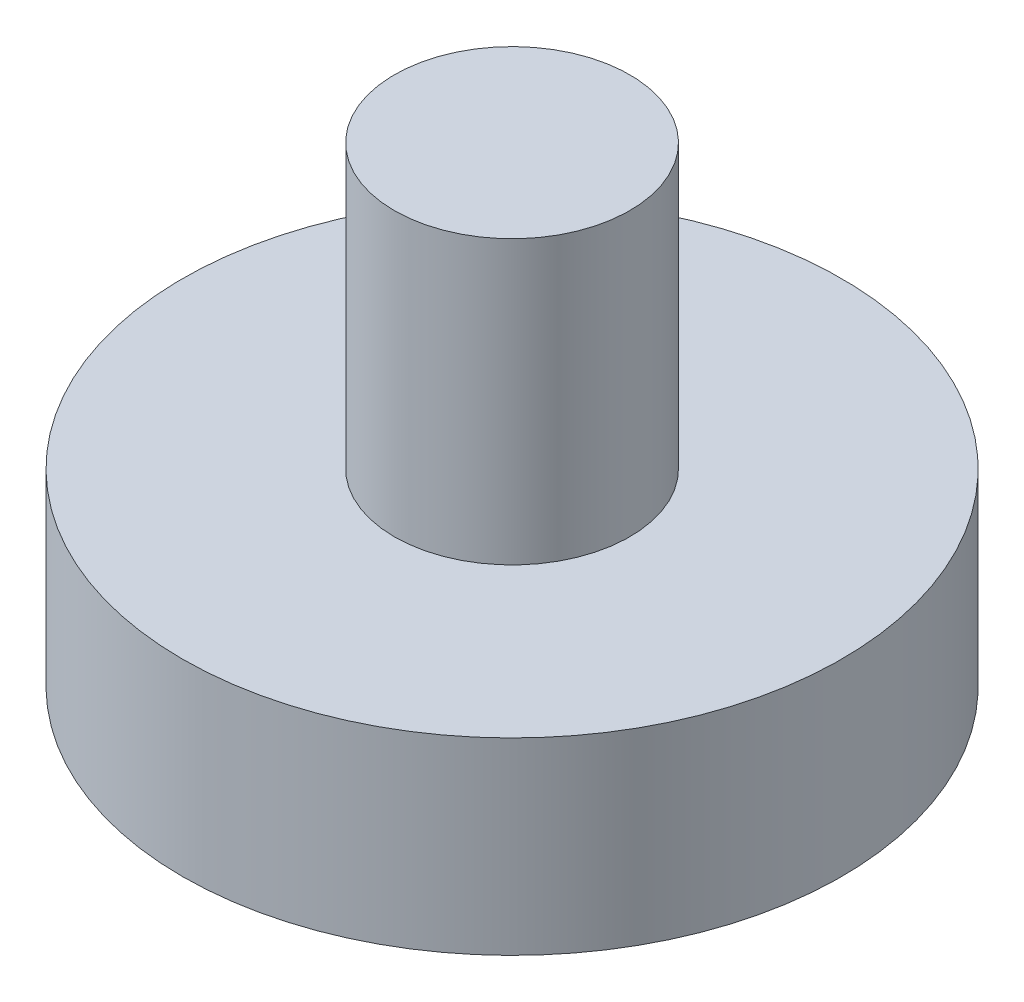
ISO-10303-21;
HEADER;
FILE_DESCRIPTION(('STEP AP214'),'2;1');
FILE_NAME('part.step','',(''),(''),'','','');
FILE_SCHEMA(('AUTOMOTIVE_DESIGN { 1 0 10303 214 1 1 1 1 }'));
ENDSEC;
DATA;
#1=APPLICATION_CONTEXT('core data for automotive mechanical design processes');
#2=APPLICATION_PROTOCOL_DEFINITION('international standard','automotive_design',2000,#1);
#3=PRODUCT_CONTEXT('',#1,'mechanical');
#4=PRODUCT('Part','Part','',(#3));
#5=PRODUCT_RELATED_PRODUCT_CATEGORY('part','',(#4));
#6=PRODUCT_DEFINITION_FORMATION('','',#4);
#7=PRODUCT_DEFINITION_CONTEXT('part definition',#1,'design');
#8=PRODUCT_DEFINITION('design','',#6,#7);
#9=PRODUCT_DEFINITION_SHAPE('','',#8);
#10=(LENGTH_UNIT() NAMED_UNIT(*) SI_UNIT(.MILLI.,.METRE.));
#11=(NAMED_UNIT(*) PLANE_ANGLE_UNIT() SI_UNIT($,.RADIAN.));
#12=(NAMED_UNIT(*) SI_UNIT($,.STERADIAN.) SOLID_ANGLE_UNIT());
#13=UNCERTAINTY_MEASURE_WITH_UNIT(LENGTH_MEASURE(1.E-05),#10,'distance_accuracy_value','');
#14=(GEOMETRIC_REPRESENTATION_CONTEXT(3) GLOBAL_UNCERTAINTY_ASSIGNED_CONTEXT((#13)) GLOBAL_UNIT_ASSIGNED_CONTEXT((#10,
#11,#12)) REPRESENTATION_CONTEXT('',''));
#15=CARTESIAN_POINT('',(0.,0.,0.));
#16=DIRECTION('',(0.,0.,1.));
#17=DIRECTION('',(1.,0.,0.));
#18=AXIS2_PLACEMENT_3D('',#15,#16,#17);
#19=CARTESIAN_POINT('',(0.,2.,0.));
#20=DIRECTION('',(0.,-1.,0.));
#21=DIRECTION('',(0.,0.,-1.));
#22=AXIS2_PLACEMENT_3D('',#19,#20,#21);
#23=CYLINDRICAL_SURFACE('',#22,3.5);
#24=CARTESIAN_POINT('',(0.,2.,0.));
#25=DIRECTION('',(0.,1.,0.));
#26=DIRECTION('',(0.,0.,1.));
#27=AXIS2_PLACEMENT_3D('',#24,#25,#26);
#28=CIRCLE('',#27,3.5);
#29=CARTESIAN_POINT('',(0.,2.,3.5));
#30=VERTEX_POINT('',#29);
#31=EDGE_CURVE('E45',#30,#30,#28,.T.);
#32=ORIENTED_EDGE('',*,*,#31,.F.);
#33=EDGE_LOOP('',(#32));
#34=FACE_BOUND('',#33,.T.);
#35=CARTESIAN_POINT('',(0.,0.,0.));
#36=DIRECTION('',(0.,1.,0.));
#37=DIRECTION('',(0.,0.,1.));
#38=AXIS2_PLACEMENT_3D('',#35,#36,#37);
#39=CIRCLE('',#38,3.5);
#40=CARTESIAN_POINT('',(0.,0.,3.5));
#41=VERTEX_POINT('',#40);
#42=EDGE_CURVE('E40',#41,#41,#39,.T.);
#43=ORIENTED_EDGE('',*,*,#42,.T.);
#44=EDGE_LOOP('',(#43));
#45=FACE_BOUND('',#44,.T.);
#46=ADVANCED_FACE('F37',(#34,#45),#23,.T.);
#47=CARTESIAN_POINT('',(0.,2.,0.));
#48=DIRECTION('',(0.,1.,0.));
#49=DIRECTION('',(0.,0.,1.));
#50=AXIS2_PLACEMENT_3D('',#47,#48,#49);
#51=PLANE('',#50);
#52=CARTESIAN_POINT('',(0.,2.,0.));
#53=DIRECTION('',(0.,1.,0.));
#54=DIRECTION('',(0.,0.,1.));
#55=AXIS2_PLACEMENT_3D('',#52,#53,#54);
#56=CIRCLE('',#55,1.25);
#57=CARTESIAN_POINT('',(0.,2.,1.25));
#58=VERTEX_POINT('',#57);
#59=EDGE_CURVE('E10',#58,#58,#56,.T.);
#60=ORIENTED_EDGE('',*,*,#59,.F.);
#61=EDGE_LOOP('',(#60));
#62=FACE_BOUND('',#61,.T.);
#63=ORIENTED_EDGE('',*,*,#31,.T.);
#64=EDGE_LOOP('',(#63));
#65=FACE_BOUND('',#64,.T.);
#66=ADVANCED_FACE('F65',(#62,#65),#51,.T.);
#67=CARTESIAN_POINT('',(0.,0.,0.));
#68=DIRECTION('',(0.,1.,0.));
#69=DIRECTION('',(0.,0.,1.));
#70=AXIS2_PLACEMENT_3D('',#67,#68,#69);
#71=PLANE('',#70);
#72=ORIENTED_EDGE('',*,*,#42,.F.);
#73=EDGE_LOOP('',(#72));
#74=FACE_BOUND('',#73,.T.);
#75=ADVANCED_FACE('F62',(#74),#71,.F.);
#76=CARTESIAN_POINT('',(0.,5.,0.));
#77=DIRECTION('',(0.,-1.,0.));
#78=DIRECTION('',(0.,0.,-1.));
#79=AXIS2_PLACEMENT_3D('',#76,#77,#78);
#80=CYLINDRICAL_SURFACE('',#79,1.25);
#81=CARTESIAN_POINT('',(0.,5.,0.));
#82=DIRECTION('',(0.,1.,0.));
#83=DIRECTION('',(0.,0.,1.));
#84=AXIS2_PLACEMENT_3D('',#81,#82,#83);
#85=CIRCLE('',#84,1.25);
#86=CARTESIAN_POINT('',(0.,5.,1.25));
#87=VERTEX_POINT('',#86);
#88=EDGE_CURVE('E52',#87,#87,#85,.T.);
#89=ORIENTED_EDGE('',*,*,#88,.F.);
#90=EDGE_LOOP('',(#89));
#91=FACE_BOUND('',#90,.T.);
#92=ORIENTED_EDGE('',*,*,#59,.T.);
#93=EDGE_LOOP('',(#92));
#94=FACE_BOUND('',#93,.T.);
#95=ADVANCED_FACE('F64',(#91,#94),#80,.T.);
#96=CARTESIAN_POINT('',(0.,5.,0.));
#97=DIRECTION('',(0.,1.,0.));
#98=DIRECTION('',(0.,0.,1.));
#99=AXIS2_PLACEMENT_3D('',#96,#97,#98);
#100=PLANE('',#99);
#101=ORIENTED_EDGE('',*,*,#88,.T.);
#102=EDGE_LOOP('',(#101));
#103=FACE_BOUND('',#102,.T.);
#104=ADVANCED_FACE('F70',(#103),#100,.T.);
#105=CLOSED_SHELL('',(#46,#66,#75,#95,#104));
#106=MANIFOLD_SOLID_BREP('B2',#105);
#107=ADVANCED_BREP_SHAPE_REPRESENTATION('',(#18,#106),#14);
#108=SHAPE_DEFINITION_REPRESENTATION(#9,#107);
ENDSEC;
END-ISO-10303-21;
